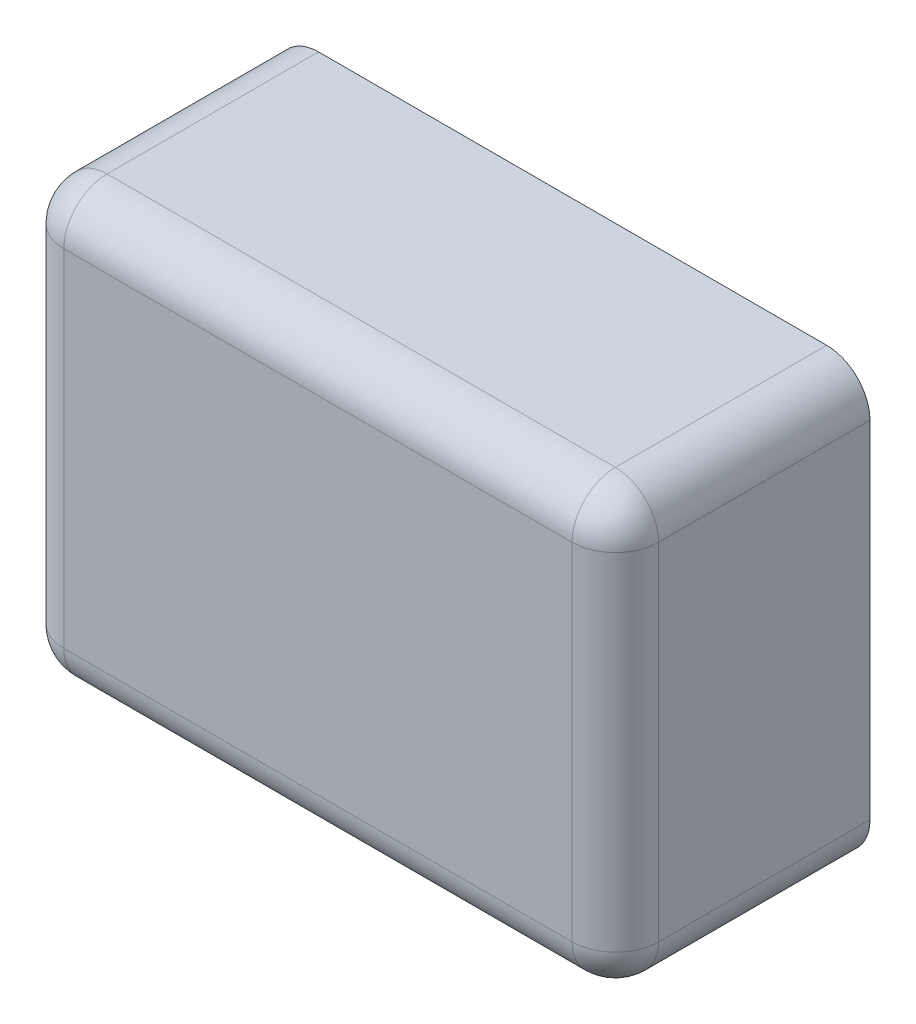
ISO-10303-21;
HEADER;
FILE_DESCRIPTION(('STEP AP214'),'2;1');
FILE_NAME('part.step','',(''),(''),'','','');
FILE_SCHEMA(('AUTOMOTIVE_DESIGN { 1 0 10303 214 1 1 1 1 }'));
ENDSEC;
DATA;
#1=APPLICATION_CONTEXT('core data for automotive mechanical design processes');
#2=APPLICATION_PROTOCOL_DEFINITION('international standard','automotive_design',2000,#1);
#3=PRODUCT_CONTEXT('',#1,'mechanical');
#4=PRODUCT('Part','Part','',(#3));
#5=PRODUCT_RELATED_PRODUCT_CATEGORY('part','',(#4));
#6=PRODUCT_DEFINITION_FORMATION('','',#4);
#7=PRODUCT_DEFINITION_CONTEXT('part definition',#1,'design');
#8=PRODUCT_DEFINITION('design','',#6,#7);
#9=PRODUCT_DEFINITION_SHAPE('','',#8);
#10=(LENGTH_UNIT() NAMED_UNIT(*) SI_UNIT(.MILLI.,.METRE.));
#11=(NAMED_UNIT(*) PLANE_ANGLE_UNIT() SI_UNIT($,.RADIAN.));
#12=(NAMED_UNIT(*) SI_UNIT($,.STERADIAN.) SOLID_ANGLE_UNIT());
#13=UNCERTAINTY_MEASURE_WITH_UNIT(LENGTH_MEASURE(1.E-05),#10,'distance_accuracy_value','');
#14=(GEOMETRIC_REPRESENTATION_CONTEXT(3) GLOBAL_UNCERTAINTY_ASSIGNED_CONTEXT((#13)) GLOBAL_UNIT_ASSIGNED_CONTEXT((#10,
#11,#12)) REPRESENTATION_CONTEXT('',''));
#15=CARTESIAN_POINT('',(0.,0.,0.));
#16=DIRECTION('',(0.,0.,1.));
#17=DIRECTION('',(1.,0.,0.));
#18=AXIS2_PLACEMENT_3D('',#15,#16,#17);
#19=CARTESIAN_POINT('',(0.,0.,0.));
#20=DIRECTION('',(0.,0.,1.));
#21=DIRECTION('',(1.,0.,0.));
#22=AXIS2_PLACEMENT_3D('',#19,#20,#21);
#23=PLANE('',#22);
#24=CARTESIAN_POINT('',(-0.47,0.32,0.));
#25=DIRECTION('',(0.,0.,1.));
#26=DIRECTION('',(-0.707106781186548,0.707106781186548,0.));
#27=AXIS2_PLACEMENT_3D('',#24,#25,#26);
#28=CIRCLE('',#27,0.08);
#29=CARTESIAN_POINT('',(-0.47,0.4,0.));
#30=VERTEX_POINT('',#29);
#31=CARTESIAN_POINT('',(-0.55,0.32,0.));
#32=VERTEX_POINT('',#31);
#33=EDGE_CURVE('E156',#30,#32,#28,.T.);
#34=ORIENTED_EDGE('',*,*,#33,.F.);
#35=DIRECTION('',(1.,0.,0.));
#36=VECTOR('',#35,1.);
#37=CARTESIAN_POINT('',(-0.55,0.4,0.));
#38=LINE('',#37,#36);
#39=CARTESIAN_POINT('',(0.47,0.4,0.));
#40=VERTEX_POINT('',#39);
#41=EDGE_CURVE('E192',#30,#40,#38,.T.);
#42=ORIENTED_EDGE('',*,*,#41,.T.);
#43=CARTESIAN_POINT('',(0.47,0.32,0.));
#44=DIRECTION('',(0.,0.,1.));
#45=DIRECTION('',(0.707106781186548,0.707106781186548,0.));
#46=AXIS2_PLACEMENT_3D('',#43,#44,#45);
#47=CIRCLE('',#46,0.08);
#48=CARTESIAN_POINT('',(0.55,0.32,0.));
#49=VERTEX_POINT('',#48);
#50=EDGE_CURVE('E176',#49,#40,#47,.T.);
#51=ORIENTED_EDGE('',*,*,#50,.F.);
#52=DIRECTION('',(0.,-1.,0.));
#53=VECTOR('',#52,1.);
#54=CARTESIAN_POINT('',(0.55,0.4,0.));
#55=LINE('',#54,#53);
#56=CARTESIAN_POINT('',(0.55,-0.32,0.));
#57=VERTEX_POINT('',#56);
#58=EDGE_CURVE('E39',#49,#57,#55,.T.);
#59=ORIENTED_EDGE('',*,*,#58,.T.);
#60=CARTESIAN_POINT('',(0.47,-0.32,0.));
#61=DIRECTION('',(0.,0.,1.));
#62=DIRECTION('',(0.707106781186548,-0.707106781186548,0.));
#63=AXIS2_PLACEMENT_3D('',#60,#61,#62);
#64=CIRCLE('',#63,0.08);
#65=CARTESIAN_POINT('',(0.47,-0.4,0.));
#66=VERTEX_POINT('',#65);
#67=EDGE_CURVE('E205',#66,#57,#64,.T.);
#68=ORIENTED_EDGE('',*,*,#67,.F.);
#69=DIRECTION('',(-1.,0.,0.));
#70=VECTOR('',#69,1.);
#71=CARTESIAN_POINT('',(0.55,-0.4,0.));
#72=LINE('',#71,#70);
#73=CARTESIAN_POINT('',(-0.47,-0.4,0.));
#74=VERTEX_POINT('',#73);
#75=EDGE_CURVE('E21',#66,#74,#72,.T.);
#76=ORIENTED_EDGE('',*,*,#75,.T.);
#77=CARTESIAN_POINT('',(-0.47,-0.32,0.));
#78=DIRECTION('',(0.,0.,1.));
#79=DIRECTION('',(-0.707106781186548,-0.707106781186548,0.));
#80=AXIS2_PLACEMENT_3D('',#77,#78,#79);
#81=CIRCLE('',#80,0.08);
#82=CARTESIAN_POINT('',(-0.55,-0.32,0.));
#83=VERTEX_POINT('',#82);
#84=EDGE_CURVE('E172',#83,#74,#81,.T.);
#85=ORIENTED_EDGE('',*,*,#84,.F.);
#86=DIRECTION('',(0.,1.,0.));
#87=VECTOR('',#86,1.);
#88=CARTESIAN_POINT('',(-0.55,-0.4,0.));
#89=LINE('',#88,#87);
#90=EDGE_CURVE('E11',#83,#32,#89,.T.);
#91=ORIENTED_EDGE('',*,*,#90,.T.);
#92=EDGE_LOOP('',(#34,#42,#51,#59,#68,#76,#85,#91));
#93=FACE_BOUND('',#92,.T.);
#94=ADVANCED_FACE('F17',(#93),#23,.F.);
#95=CARTESIAN_POINT('',(-0.55,0.4,0.));
#96=DIRECTION('',(-1.,0.,0.));
#97=DIRECTION('',(0.,1.,0.));
#98=AXIS2_PLACEMENT_3D('',#95,#96,#97);
#99=PLANE('',#98);
#100=DIRECTION('',(0.,0.,1.));
#101=VECTOR('',#100,1.);
#102=CARTESIAN_POINT('',(-0.55,0.32,0.));
#103=LINE('',#102,#101);
#104=CARTESIAN_POINT('',(-0.55,0.32,0.391));
#105=VERTEX_POINT('',#104);
#106=EDGE_CURVE('E182',#32,#105,#103,.T.);
#107=ORIENTED_EDGE('',*,*,#106,.F.);
#108=ORIENTED_EDGE('',*,*,#90,.F.);
#109=DIRECTION('',(0.,0.,-1.));
#110=VECTOR('',#109,1.);
#111=CARTESIAN_POINT('',(-0.55,-0.32,0.));
#112=LINE('',#111,#110);
#113=CARTESIAN_POINT('',(-0.55,-0.32,0.391));
#114=VERTEX_POINT('',#113);
#115=EDGE_CURVE('E171',#114,#83,#112,.T.);
#116=ORIENTED_EDGE('',*,*,#115,.F.);
#117=DIRECTION('',(0.,-1.,0.));
#118=VECTOR('',#117,1.);
#119=CARTESIAN_POINT('',(-0.55,0.2,0.391));
#120=LINE('',#119,#118);
#121=EDGE_CURVE('E133',#105,#114,#120,.T.);
#122=ORIENTED_EDGE('',*,*,#121,.F.);
#123=EDGE_LOOP('',(#107,#108,#116,#122));
#124=FACE_BOUND('',#123,.T.);
#125=ADVANCED_FACE('F19',(#124),#99,.T.);
#126=CARTESIAN_POINT('',(-0.55,-0.4,0.));
#127=DIRECTION('',(0.,-1.,0.));
#128=DIRECTION('',(0.,0.,-1.));
#129=AXIS2_PLACEMENT_3D('',#126,#127,#128);
#130=PLANE('',#129);
#131=DIRECTION('',(0.,0.,1.));
#132=VECTOR('',#131,1.);
#133=CARTESIAN_POINT('',(-0.47,-0.4,0.));
#134=LINE('',#133,#132);
#135=CARTESIAN_POINT('',(-0.47,-0.4,0.391));
#136=VERTEX_POINT('',#135);
#137=EDGE_CURVE('E168',#74,#136,#134,.T.);
#138=ORIENTED_EDGE('',*,*,#137,.F.);
#139=ORIENTED_EDGE('',*,*,#75,.F.);
#140=DIRECTION('',(0.,0.,-1.));
#141=VECTOR('',#140,1.);
#142=CARTESIAN_POINT('',(0.47,-0.4,0.));
#143=LINE('',#142,#141);
#144=CARTESIAN_POINT('',(0.47,-0.4,0.391));
#145=VERTEX_POINT('',#144);
#146=EDGE_CURVE('E204',#145,#66,#143,.T.);
#147=ORIENTED_EDGE('',*,*,#146,.F.);
#148=DIRECTION('',(1.,0.,0.));
#149=VECTOR('',#148,1.);
#150=CARTESIAN_POINT('',(-0.275,-0.4,0.391));
#151=LINE('',#150,#149);
#152=EDGE_CURVE('E134',#136,#145,#151,.T.);
#153=ORIENTED_EDGE('',*,*,#152,.F.);
#154=EDGE_LOOP('',(#138,#139,#147,#153));
#155=FACE_BOUND('',#154,.T.);
#156=ADVANCED_FACE('F281',(#155),#130,.T.);
#157=CARTESIAN_POINT('',(0.,0.,0.471));
#158=DIRECTION('',(0.,0.,1.));
#159=DIRECTION('',(1.,0.,0.));
#160=AXIS2_PLACEMENT_3D('',#157,#158,#159);
#161=PLANE('',#160);
#162=DIRECTION('',(1.,0.,0.));
#163=VECTOR('',#162,1.);
#164=CARTESIAN_POINT('',(0.275,0.32,0.471));
#165=LINE('',#164,#163);
#166=CARTESIAN_POINT('',(-0.47,0.32,0.471));
#167=VERTEX_POINT('',#166);
#168=CARTESIAN_POINT('',(0.47,0.32,0.471));
#169=VERTEX_POINT('',#168);
#170=EDGE_CURVE('E137',#167,#169,#165,.T.);
#171=ORIENTED_EDGE('',*,*,#170,.F.);
#172=DIRECTION('',(0.,1.,0.));
#173=VECTOR('',#172,1.);
#174=CARTESIAN_POINT('',(-0.47,0.2,0.471));
#175=LINE('',#174,#173);
#176=CARTESIAN_POINT('',(-0.47,-0.32,0.471));
#177=VERTEX_POINT('',#176);
#178=EDGE_CURVE('E122',#177,#167,#175,.T.);
#179=ORIENTED_EDGE('',*,*,#178,.F.);
#180=DIRECTION('',(-1.,0.,0.));
#181=VECTOR('',#180,1.);
#182=CARTESIAN_POINT('',(-0.275,-0.32,0.471));
#183=LINE('',#182,#181);
#184=CARTESIAN_POINT('',(0.47,-0.32,0.471));
#185=VERTEX_POINT('',#184);
#186=EDGE_CURVE('E258',#185,#177,#183,.T.);
#187=ORIENTED_EDGE('',*,*,#186,.F.);
#188=DIRECTION('',(0.,-1.,0.));
#189=VECTOR('',#188,1.);
#190=CARTESIAN_POINT('',(0.47,-0.2,0.471));
#191=LINE('',#190,#189);
#192=EDGE_CURVE('E140',#169,#185,#191,.T.);
#193=ORIENTED_EDGE('',*,*,#192,.F.);
#194=EDGE_LOOP('',(#171,#179,#187,#193));
#195=FACE_BOUND('',#194,.T.);
#196=ADVANCED_FACE('F138',(#195),#161,.T.);
#197=CARTESIAN_POINT('',(0.55,-0.4,0.));
#198=DIRECTION('',(1.,0.,0.));
#199=DIRECTION('',(0.,1.,0.));
#200=AXIS2_PLACEMENT_3D('',#197,#198,#199);
#201=PLANE('',#200);
#202=DIRECTION('',(0.,0.,-1.));
#203=VECTOR('',#202,1.);
#204=CARTESIAN_POINT('',(0.55,0.32,0.));
#205=LINE('',#204,#203);
#206=CARTESIAN_POINT('',(0.55,0.32,0.391));
#207=VERTEX_POINT('',#206);
#208=EDGE_CURVE('E147',#207,#49,#205,.T.);
#209=ORIENTED_EDGE('',*,*,#208,.F.);
#210=DIRECTION('',(0.,1.,0.));
#211=VECTOR('',#210,1.);
#212=CARTESIAN_POINT('',(0.55,-0.2,0.391));
#213=LINE('',#212,#211);
#214=CARTESIAN_POINT('',(0.55,-0.32,0.391));
#215=VERTEX_POINT('',#214);
#216=EDGE_CURVE('E255',#215,#207,#213,.T.);
#217=ORIENTED_EDGE('',*,*,#216,.F.);
#218=DIRECTION('',(0.,0.,1.));
#219=VECTOR('',#218,1.);
#220=CARTESIAN_POINT('',(0.55,-0.32,0.));
#221=LINE('',#220,#219);
#222=EDGE_CURVE('E200',#57,#215,#221,.T.);
#223=ORIENTED_EDGE('',*,*,#222,.F.);
#224=ORIENTED_EDGE('',*,*,#58,.F.);
#225=EDGE_LOOP('',(#209,#217,#223,#224));
#226=FACE_BOUND('',#225,.T.);
#227=ADVANCED_FACE('F274',(#226),#201,.T.);
#228=CARTESIAN_POINT('',(0.55,0.4,0.));
#229=DIRECTION('',(0.,1.,0.));
#230=DIRECTION('',(1.,0.,0.));
#231=AXIS2_PLACEMENT_3D('',#228,#229,#230);
#232=PLANE('',#231);
#233=DIRECTION('',(0.,0.,-1.));
#234=VECTOR('',#233,1.);
#235=CARTESIAN_POINT('',(-0.47,0.4,0.));
#236=LINE('',#235,#234);
#237=CARTESIAN_POINT('',(-0.47,0.4,0.391));
#238=VERTEX_POINT('',#237);
#239=EDGE_CURVE('E186',#238,#30,#236,.T.);
#240=ORIENTED_EDGE('',*,*,#239,.F.);
#241=DIRECTION('',(-1.,0.,0.));
#242=VECTOR('',#241,1.);
#243=CARTESIAN_POINT('',(0.275,0.4,0.391));
#244=LINE('',#243,#242);
#245=CARTESIAN_POINT('',(0.47,0.4,0.391));
#246=VERTEX_POINT('',#245);
#247=EDGE_CURVE('E146',#246,#238,#244,.T.);
#248=ORIENTED_EDGE('',*,*,#247,.F.);
#249=DIRECTION('',(0.,0.,1.));
#250=VECTOR('',#249,1.);
#251=CARTESIAN_POINT('',(0.47,0.4,0.));
#252=LINE('',#251,#250);
#253=EDGE_CURVE('E209',#40,#246,#252,.T.);
#254=ORIENTED_EDGE('',*,*,#253,.F.);
#255=ORIENTED_EDGE('',*,*,#41,.F.);
#256=EDGE_LOOP('',(#240,#248,#254,#255));
#257=FACE_BOUND('',#256,.T.);
#258=ADVANCED_FACE('F268',(#257),#232,.T.);
#259=CARTESIAN_POINT('',(-0.47,0.2,0.391));
#260=DIRECTION('',(0.,-1.,0.));
#261=DIRECTION('',(-0.707106781186548,0.,0.707106781186548));
#262=AXIS2_PLACEMENT_3D('',#259,#260,#261);
#263=CYLINDRICAL_SURFACE('',#262,0.08);
#264=CARTESIAN_POINT('',(-0.47,-0.32,0.391));
#265=DIRECTION('',(0.,-1.,0.));
#266=DIRECTION('',(-1.,0.,0.));
#267=AXIS2_PLACEMENT_3D('',#264,#265,#266);
#268=CIRCLE('',#267,0.08);
#269=EDGE_CURVE('E129',#177,#114,#268,.T.);
#270=ORIENTED_EDGE('',*,*,#269,.F.);
#271=ORIENTED_EDGE('',*,*,#178,.T.);
#272=CARTESIAN_POINT('',(-0.47,0.32,0.391));
#273=DIRECTION('',(0.,1.,0.));
#274=DIRECTION('',(0.,0.,1.));
#275=AXIS2_PLACEMENT_3D('',#272,#273,#274);
#276=CIRCLE('',#275,0.08);
#277=EDGE_CURVE('E126',#105,#167,#276,.T.);
#278=ORIENTED_EDGE('',*,*,#277,.F.);
#279=ORIENTED_EDGE('',*,*,#121,.T.);
#280=EDGE_LOOP('',(#270,#271,#278,#279));
#281=FACE_BOUND('',#280,.T.);
#282=ADVANCED_FACE('F124',(#281),#263,.T.);
#283=CARTESIAN_POINT('',(-0.275,-0.32,0.391));
#284=DIRECTION('',(1.,0.,0.));
#285=DIRECTION('',(0.,-0.707106781186548,0.707106781186548));
#286=AXIS2_PLACEMENT_3D('',#283,#284,#285);
#287=CYLINDRICAL_SURFACE('',#286,0.08);
#288=CARTESIAN_POINT('',(0.47,-0.32,0.391));
#289=DIRECTION('',(1.,0.,0.));
#290=DIRECTION('',(0.,-1.,0.));
#291=AXIS2_PLACEMENT_3D('',#288,#289,#290);
#292=CIRCLE('',#291,0.08);
#293=EDGE_CURVE('E236',#185,#145,#292,.T.);
#294=ORIENTED_EDGE('',*,*,#293,.F.);
#295=ORIENTED_EDGE('',*,*,#186,.T.);
#296=CARTESIAN_POINT('',(-0.47,-0.32,0.391));
#297=DIRECTION('',(-1.,0.,0.));
#298=DIRECTION('',(0.,0.,1.));
#299=AXIS2_PLACEMENT_3D('',#296,#297,#298);
#300=CIRCLE('',#299,0.08);
#301=EDGE_CURVE('E199',#136,#177,#300,.T.);
#302=ORIENTED_EDGE('',*,*,#301,.F.);
#303=ORIENTED_EDGE('',*,*,#152,.T.);
#304=EDGE_LOOP('',(#294,#295,#302,#303));
#305=FACE_BOUND('',#304,.T.);
#306=ADVANCED_FACE('F320',(#305),#287,.T.);
#307=CARTESIAN_POINT('',(0.47,-0.2,0.391));
#308=DIRECTION('',(0.,1.,0.));
#309=DIRECTION('',(0.707106781186548,0.,0.707106781186548));
#310=AXIS2_PLACEMENT_3D('',#307,#308,#309);
#311=CYLINDRICAL_SURFACE('',#310,0.08);
#312=CARTESIAN_POINT('',(0.47,0.32,0.391));
#313=DIRECTION('',(0.,1.,0.));
#314=DIRECTION('',(1.,0.,0.));
#315=AXIS2_PLACEMENT_3D('',#312,#313,#314);
#316=CIRCLE('',#315,0.08);
#317=EDGE_CURVE('E219',#169,#207,#316,.T.);
#318=ORIENTED_EDGE('',*,*,#317,.F.);
#319=ORIENTED_EDGE('',*,*,#192,.T.);
#320=CARTESIAN_POINT('',(0.47,-0.32,0.391));
#321=DIRECTION('',(0.,-1.,0.));
#322=DIRECTION('',(0.,0.,1.));
#323=AXIS2_PLACEMENT_3D('',#320,#321,#322);
#324=CIRCLE('',#323,0.08);
#325=EDGE_CURVE('E244',#215,#185,#324,.T.);
#326=ORIENTED_EDGE('',*,*,#325,.F.);
#327=ORIENTED_EDGE('',*,*,#216,.T.);
#328=EDGE_LOOP('',(#318,#319,#326,#327));
#329=FACE_BOUND('',#328,.T.);
#330=ADVANCED_FACE('F309',(#329),#311,.T.);
#331=CARTESIAN_POINT('',(0.47,-0.32,0.));
#332=DIRECTION('',(0.,0.,1.));
#333=DIRECTION('',(0.707106781186548,-0.707106781186548,0.));
#334=AXIS2_PLACEMENT_3D('',#331,#332,#333);
#335=CYLINDRICAL_SURFACE('',#334,0.08);
#336=ORIENTED_EDGE('',*,*,#67,.T.);
#337=ORIENTED_EDGE('',*,*,#222,.T.);
#338=CARTESIAN_POINT('',(0.47,-0.32,0.391));
#339=DIRECTION('',(0.,0.,1.));
#340=DIRECTION('',(1.,0.,0.));
#341=AXIS2_PLACEMENT_3D('',#338,#339,#340);
#342=CIRCLE('',#341,0.08);
#343=EDGE_CURVE('E240',#145,#215,#342,.T.);
#344=ORIENTED_EDGE('',*,*,#343,.F.);
#345=ORIENTED_EDGE('',*,*,#146,.T.);
#346=EDGE_LOOP('',(#336,#337,#344,#345));
#347=FACE_BOUND('',#346,.T.);
#348=ADVANCED_FACE('F278',(#347),#335,.T.);
#349=CARTESIAN_POINT('',(0.47,-0.32,0.391));
#350=DIRECTION('',(-0.816496580927726,-0.408248290463863,0.408248290463863));
#351=DIRECTION('',(0.577350269189626,-0.577350269189626,0.577350269189626));
#352=AXIS2_PLACEMENT_3D('',#349,#350,#351);
#353=SPHERICAL_SURFACE('',#352,0.08);
#354=ORIENTED_EDGE('',*,*,#293,.T.);
#355=ORIENTED_EDGE('',*,*,#343,.T.);
#356=ORIENTED_EDGE('',*,*,#325,.T.);
#357=EDGE_LOOP('',(#354,#355,#356));
#358=FACE_BOUND('',#357,.T.);
#359=ADVANCED_FACE('F314',(#358),#353,.T.);
#360=CARTESIAN_POINT('',(0.275,0.32,0.391));
#361=DIRECTION('',(-1.,0.,0.));
#362=DIRECTION('',(0.,0.707106781186548,0.707106781186548));
#363=AXIS2_PLACEMENT_3D('',#360,#361,#362);
#364=CYLINDRICAL_SURFACE('',#363,0.08);
#365=CARTESIAN_POINT('',(-0.47,0.32,0.391));
#366=DIRECTION('',(-1.,0.,0.));
#367=DIRECTION('',(0.,1.,0.));
#368=AXIS2_PLACEMENT_3D('',#365,#366,#367);
#369=CIRCLE('',#368,0.08);
#370=EDGE_CURVE('E152',#167,#238,#369,.T.);
#371=ORIENTED_EDGE('',*,*,#370,.F.);
#372=ORIENTED_EDGE('',*,*,#170,.T.);
#373=CARTESIAN_POINT('',(0.47,0.32,0.391));
#374=DIRECTION('',(1.,0.,0.));
#375=DIRECTION('',(0.,0.,1.));
#376=AXIS2_PLACEMENT_3D('',#373,#374,#375);
#377=CIRCLE('',#376,0.08);
#378=EDGE_CURVE('E174',#246,#169,#377,.T.);
#379=ORIENTED_EDGE('',*,*,#378,.F.);
#380=ORIENTED_EDGE('',*,*,#247,.T.);
#381=EDGE_LOOP('',(#371,#372,#379,#380));
#382=FACE_BOUND('',#381,.T.);
#383=ADVANCED_FACE('F158',(#382),#364,.T.);
#384=CARTESIAN_POINT('',(0.47,0.32,0.));
#385=DIRECTION('',(0.,0.,1.));
#386=DIRECTION('',(0.707106781186548,0.707106781186548,0.));
#387=AXIS2_PLACEMENT_3D('',#384,#385,#386);
#388=CYLINDRICAL_SURFACE('',#387,0.08);
#389=ORIENTED_EDGE('',*,*,#50,.T.);
#390=ORIENTED_EDGE('',*,*,#253,.T.);
#391=CARTESIAN_POINT('',(0.47,0.32,0.391));
#392=DIRECTION('',(0.,0.,1.));
#393=DIRECTION('',(0.,1.,0.));
#394=AXIS2_PLACEMENT_3D('',#391,#392,#393);
#395=CIRCLE('',#394,0.08);
#396=EDGE_CURVE('E177',#207,#246,#395,.T.);
#397=ORIENTED_EDGE('',*,*,#396,.F.);
#398=ORIENTED_EDGE('',*,*,#208,.T.);
#399=EDGE_LOOP('',(#389,#390,#397,#398));
#400=FACE_BOUND('',#399,.T.);
#401=ADVANCED_FACE('F271',(#400),#388,.T.);
#402=CARTESIAN_POINT('',(0.47,0.32,0.391));
#403=DIRECTION('',(0.408248290463863,0.408248290463863,-0.816496580927726));
#404=DIRECTION('',(0.577350269189626,0.577350269189626,0.577350269189626));
#405=AXIS2_PLACEMENT_3D('',#402,#403,#404);
#406=SPHERICAL_SURFACE('',#405,0.08);
#407=ORIENTED_EDGE('',*,*,#317,.T.);
#408=ORIENTED_EDGE('',*,*,#396,.T.);
#409=ORIENTED_EDGE('',*,*,#378,.T.);
#410=EDGE_LOOP('',(#407,#408,#409));
#411=FACE_BOUND('',#410,.T.);
#412=ADVANCED_FACE('F325',(#411),#406,.T.);
#413=CARTESIAN_POINT('',(-0.47,-0.32,0.));
#414=DIRECTION('',(0.,0.,1.));
#415=DIRECTION('',(-0.707106781186548,-0.707106781186548,0.));
#416=AXIS2_PLACEMENT_3D('',#413,#414,#415);
#417=CYLINDRICAL_SURFACE('',#416,0.08);
#418=ORIENTED_EDGE('',*,*,#84,.T.);
#419=ORIENTED_EDGE('',*,*,#137,.T.);
#420=CARTESIAN_POINT('',(-0.47,-0.32,0.391));
#421=DIRECTION('',(0.,0.,1.));
#422=DIRECTION('',(0.,-1.,0.));
#423=AXIS2_PLACEMENT_3D('',#420,#421,#422);
#424=CIRCLE('',#423,0.08);
#425=EDGE_CURVE('E195',#114,#136,#424,.T.);
#426=ORIENTED_EDGE('',*,*,#425,.F.);
#427=ORIENTED_EDGE('',*,*,#115,.T.);
#428=EDGE_LOOP('',(#418,#419,#426,#427));
#429=FACE_BOUND('',#428,.T.);
#430=ADVANCED_FACE('F285',(#429),#417,.T.);
#431=CARTESIAN_POINT('',(-0.47,-0.32,0.391));
#432=DIRECTION('',(-0.408248290463863,-0.408248290463863,-0.816496580927726));
#433=DIRECTION('',(-0.577350269189626,-0.577350269189626,0.577350269189626));
#434=AXIS2_PLACEMENT_3D('',#431,#432,#433);
#435=SPHERICAL_SURFACE('',#434,0.08);
#436=ORIENTED_EDGE('',*,*,#269,.T.);
#437=ORIENTED_EDGE('',*,*,#425,.T.);
#438=ORIENTED_EDGE('',*,*,#301,.T.);
#439=EDGE_LOOP('',(#436,#437,#438));
#440=FACE_BOUND('',#439,.T.);
#441=ADVANCED_FACE('F292',(#440),#435,.T.);
#442=CARTESIAN_POINT('',(-0.47,0.32,0.));
#443=DIRECTION('',(0.,0.,1.));
#444=DIRECTION('',(-0.707106781186548,0.707106781186548,0.));
#445=AXIS2_PLACEMENT_3D('',#442,#443,#444);
#446=CYLINDRICAL_SURFACE('',#445,0.08);
#447=ORIENTED_EDGE('',*,*,#33,.T.);
#448=ORIENTED_EDGE('',*,*,#106,.T.);
#449=CARTESIAN_POINT('',(-0.47,0.32,0.391));
#450=DIRECTION('',(0.,0.,1.));
#451=DIRECTION('',(-1.,0.,0.));
#452=AXIS2_PLACEMENT_3D('',#449,#450,#451);
#453=CIRCLE('',#452,0.08);
#454=EDGE_CURVE('E154',#238,#105,#453,.T.);
#455=ORIENTED_EDGE('',*,*,#454,.F.);
#456=ORIENTED_EDGE('',*,*,#239,.T.);
#457=EDGE_LOOP('',(#447,#448,#455,#456));
#458=FACE_BOUND('',#457,.T.);
#459=ADVANCED_FACE('F290',(#458),#446,.T.);
#460=CARTESIAN_POINT('',(-0.47,0.32,0.391));
#461=DIRECTION('',(-0.408248290463863,-0.816496580927726,0.408248290463863));
#462=DIRECTION('',(-0.577350269189626,0.577350269189626,0.577350269189626));
#463=AXIS2_PLACEMENT_3D('',#460,#461,#462);
#464=SPHERICAL_SURFACE('',#463,0.08);
#465=ORIENTED_EDGE('',*,*,#370,.T.);
#466=ORIENTED_EDGE('',*,*,#454,.T.);
#467=ORIENTED_EDGE('',*,*,#277,.T.);
#468=EDGE_LOOP('',(#465,#466,#467));
#469=FACE_BOUND('',#468,.T.);
#470=ADVANCED_FACE('F151',(#469),#464,.T.);
#471=CLOSED_SHELL('',(#94,#125,#156,#196,#227,#258,#282,#306,#330,#348,#359,#383,#401,#412,#430,
#441,#459,#470));
#472=MANIFOLD_SOLID_BREP('B1',#471);
#473=ADVANCED_BREP_SHAPE_REPRESENTATION('',(#18,#472),#14);
#474=SHAPE_DEFINITION_REPRESENTATION(#9,#473);
ENDSEC;
END-ISO-10303-21;
